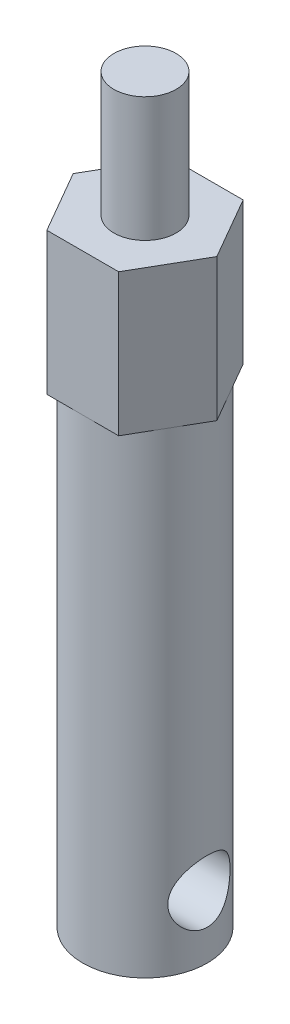
ISO-10303-21;
HEADER;
FILE_DESCRIPTION(('STEP AP214'),'2;1');
FILE_NAME('part.step','',(''),(''),'','','');
FILE_SCHEMA(('AUTOMOTIVE_DESIGN { 1 0 10303 214 1 1 1 1 }'));
ENDSEC;
DATA;
#1=APPLICATION_CONTEXT('core data for automotive mechanical design processes');
#2=APPLICATION_PROTOCOL_DEFINITION('international standard','automotive_design',2000,#1);
#3=PRODUCT_CONTEXT('',#1,'mechanical');
#4=PRODUCT('Part','Part','',(#3));
#5=PRODUCT_RELATED_PRODUCT_CATEGORY('part','',(#4));
#6=PRODUCT_DEFINITION_FORMATION('','',#4);
#7=PRODUCT_DEFINITION_CONTEXT('part definition',#1,'design');
#8=PRODUCT_DEFINITION('design','',#6,#7);
#9=PRODUCT_DEFINITION_SHAPE('','',#8);
#10=(LENGTH_UNIT() NAMED_UNIT(*) SI_UNIT(.MILLI.,.METRE.));
#11=(NAMED_UNIT(*) PLANE_ANGLE_UNIT() SI_UNIT($,.RADIAN.));
#12=(NAMED_UNIT(*) SI_UNIT($,.STERADIAN.) SOLID_ANGLE_UNIT());
#13=UNCERTAINTY_MEASURE_WITH_UNIT(LENGTH_MEASURE(1.E-05),#10,'distance_accuracy_value','');
#14=(GEOMETRIC_REPRESENTATION_CONTEXT(3) GLOBAL_UNCERTAINTY_ASSIGNED_CONTEXT((#13)) GLOBAL_UNIT_ASSIGNED_CONTEXT((#10,
#11,#12)) REPRESENTATION_CONTEXT('',''));
#15=CARTESIAN_POINT('',(0.,0.,0.));
#16=DIRECTION('',(0.,0.,1.));
#17=DIRECTION('',(1.,0.,0.));
#18=AXIS2_PLACEMENT_3D('',#15,#16,#17);
#19=CARTESIAN_POINT('',(0.,48.44415,0.));
#20=DIRECTION('',(0.,-1.,0.));
#21=DIRECTION('',(0.,0.,-1.));
#22=AXIS2_PLACEMENT_3D('',#19,#20,#21);
#23=CYLINDRICAL_SURFACE('',#22,6.35);
#24=CARTESIAN_POINT('',(-5.49926131403118,6.35,-3.175));
#25=CARTESIAN_POINT('',(-5.49926232876913,6.43276191353255,-3.17499905676822));
#26=CARTESIAN_POINT('',(-5.50113815093942,6.51553391504167,-3.1717573852825));
#27=CARTESIAN_POINT('',(-5.50856077670455,6.68042021285867,-3.15884523354688));
#28=CARTESIAN_POINT('',(-5.51410928932437,6.76253418495082,-3.1491717603564));
#29=CARTESIAN_POINT('',(-5.53601678924102,7.0071657484108,-3.11062065473092));
#30=CARTESIAN_POINT('',(-5.55763722742636,7.16782804698103,-3.07221261154103));
#31=CARTESIAN_POINT('',(-5.61178865498313,7.47859781214575,-2.97211747978078));
#32=CARTESIAN_POINT('',(-5.6442615458663,7.62875644018636,-2.9105541372517));
#33=CARTESIAN_POINT('',(-5.71635543890045,7.91661142280003,-2.76627435445934));
#34=CARTESIAN_POINT('',(-5.75597682772092,8.05430710263429,-2.68355676984061));
#35=CARTESIAN_POINT('',(-5.84190034267495,8.32582382133968,-2.49131627779835));
#36=CARTESIAN_POINT('',(-5.88848395338309,8.45838859728169,-2.38014521787043));
#37=CARTESIAN_POINT('',(-5.98081052060146,8.70397079125477,-2.13758083606043));
#38=CARTESIAN_POINT('',(-6.02655304768282,8.816978458905,-2.00617748851801));
#39=CARTESIAN_POINT('',(-6.11573187346572,9.02769095285005,-1.71605436473863));
#40=CARTESIAN_POINT('',(-6.15880487346127,9.12385077893965,-1.55609032527602));
#41=CARTESIAN_POINT('',(-6.23413651147239,9.28732214311138,-1.21969855929243));
#42=CARTESIAN_POINT('',(-6.26640197156108,9.35465188718596,-1.04328130884119));
#43=CARTESIAN_POINT('',(-6.31445464313237,9.45357731453854,-0.692292696730404));
#44=CARTESIAN_POINT('',(-6.33125099630315,9.48737474679419,-0.51848318375818));
#45=CARTESIAN_POINT('',(-6.35024078782237,9.52552742617825,-0.166911747158856));
#46=CARTESIAN_POINT('',(-6.35244306187831,9.52990048775664,0.0108477196166782));
#47=CARTESIAN_POINT('',(-6.34247467450733,9.50992929879483,0.348718268640212));
#48=CARTESIAN_POINT('',(-6.33153724004097,9.48804925678407,0.509019820270688));
#49=CARTESIAN_POINT('',(-6.29838229153245,9.42060336454205,0.823321212955329));
#50=CARTESIAN_POINT('',(-6.27616393341038,9.37503574191341,0.977320581525264));
#51=CARTESIAN_POINT('',(-6.22209775234818,9.2612126859772,1.27733236684466));
#52=CARTESIAN_POINT('',(-6.19012095460315,9.19265207947932,1.42320480220676));
#53=CARTESIAN_POINT('',(-6.11942032404916,9.03521427998409,1.70172616219331));
#54=CARTESIAN_POINT('',(-6.08069407688628,8.94632981335227,1.83437032813194));
#55=CARTESIAN_POINT('',(-5.99580926070808,8.74110469841399,2.09605211974366));
#56=CARTESIAN_POINT('',(-5.94929416927823,8.62296290957092,2.22356359612797));
#57=CARTESIAN_POINT('',(-5.85642633307518,8.36743760647979,2.45777846555886));
#58=CARTESIAN_POINT('',(-5.81007373990265,8.23003942646041,2.56446584928023));
#59=CARTESIAN_POINT('',(-5.71957289604347,7.92905223163107,2.76069102698818));
#60=CARTESIAN_POINT('',(-5.67575155752789,7.76435408894133,2.84870951352546));
#61=CARTESIAN_POINT('',(-5.61885247415839,7.50616243386923,2.95849503046443));
#62=CARTESIAN_POINT('',(-5.60135560040996,7.41822207148829,2.99138760520285));
#63=CARTESIAN_POINT('',(-5.56999217748627,7.23920256178856,3.04938956554735));
#64=CARTESIAN_POINT('',(-5.55612339050229,7.14812538868085,3.07450375064138));
#65=CARTESIAN_POINT('',(-5.53355357587716,6.97084836859624,3.11492823782859));
#66=CARTESIAN_POINT('',(-5.52453156228568,6.88482935786662,3.13085491331031));
#67=CARTESIAN_POINT('',(-5.51045313491466,6.71148937241193,3.15556797554225));
#68=CARTESIAN_POINT('',(-5.50539465890766,6.62416909886637,3.16435807553686));
#69=CARTESIAN_POINT('',(-5.49945626530651,6.44898485113381,3.17466835867007));
#70=CARTESIAN_POINT('',(-5.49857479177741,6.36112109160959,3.17619124884848));
#71=CARTESIAN_POINT('',(-5.50101508803298,6.18565516235741,3.17195985852084));
#72=CARTESIAN_POINT('',(-5.50433657410105,6.09805297537237,3.16620606921981));
#73=CARTESIAN_POINT('',(-5.51925588435845,5.85590741435482,3.14018226453034));
#74=CARTESIAN_POINT('',(-5.53528611699027,5.70239439247137,3.11209439281024));
#75=CARTESIAN_POINT('',(-5.57828096923593,5.40265311940665,3.0343376295836));
#76=CARTESIAN_POINT('',(-5.60524912972109,5.25642724447968,2.98466174914483));
#77=CARTESIAN_POINT('',(-5.66852625788959,4.96757737335142,2.86273054239685));
#78=CARTESIAN_POINT('',(-5.70520999770139,4.82543386796816,2.78953600385261));
#79=CARTESIAN_POINT('',(-5.7834564691364,4.55463281522928,2.62346157669833));
#80=CARTESIAN_POINT('',(-5.82502170218951,4.42598224655787,2.53057157570877));
#81=CARTESIAN_POINT('',(-5.91464405440152,4.16884312848128,2.31405795861388));
#82=CARTESIAN_POINT('',(-5.96285904289681,4.04241923829748,2.18803622695199));
#83=CARTESIAN_POINT('',(-6.0558119327906,3.81186595247963,1.91580928554187));
#84=CARTESIAN_POINT('',(-6.10054865642871,3.70774408767676,1.76959728537411));
#85=CARTESIAN_POINT('',(-6.18303824145362,3.52242847331789,1.45584977269243));
#86=CARTESIAN_POINT('',(-6.22057562531784,3.44191236317373,1.28785333421913));
#87=CARTESIAN_POINT('',(-6.28279651772886,3.31108714177129,0.93828350831361));
#88=CARTESIAN_POINT('',(-6.30749131056505,3.26075150612559,0.756722200806245));
#89=CARTESIAN_POINT('',(-6.33944338582815,3.19605480945969,0.403160492410787));
#90=CARTESIAN_POINT('',(-6.34809271326659,3.17881673569817,0.231811338563335));
#91=CARTESIAN_POINT('',(-6.35133763722966,3.17232264057451,-0.111525009731682));
#92=CARTESIAN_POINT('',(-6.3459381534549,3.18305682371448,-0.283511959769309));
#93=CARTESIAN_POINT('',(-6.32250351776756,3.23029705955796,-0.611308110350746));
#94=CARTESIAN_POINT('',(-6.30532443151586,3.26505827986283,-0.767436553820505));
#95=CARTESIAN_POINT('',(-6.26084894800281,3.35701333933393,-1.07139095342116));
#96=CARTESIAN_POINT('',(-6.23355109988091,3.41421039549079,-1.21921571544173));
#97=CARTESIAN_POINT('',(-6.16984840144776,3.55195793786225,-1.50946910032131));
#98=CARTESIAN_POINT('',(-6.13310397734646,3.6334026281259,-1.65139651176319));
#99=CARTESIAN_POINT('',(-6.05434784579293,3.81621815432935,-1.92016030444462));
#100=CARTESIAN_POINT('',(-6.0123337223239,3.91759814225474,-2.04698971133066));
#101=CARTESIAN_POINT('',(-5.92228494250573,4.14907383129508,-2.29524860659569));
#102=CARTESIAN_POINT('',(-5.87406724075615,4.28102323115206,-2.41488454123001));
#103=CARTESIAN_POINT('',(-5.78049654064408,4.56393373054089,-2.63101905620371));
#104=CARTESIAN_POINT('',(-5.73514610261339,4.71491147125789,-2.7274971667743));
#105=CARTESIAN_POINT('',(-5.67271720109896,4.95567948124437,-2.85396050304134));
#106=CARTESIAN_POINT('',(-5.65257123598791,5.03975772270639,-2.89354057606825));
#107=CARTESIAN_POINT('',(-5.61522862075768,5.21160722451755,-2.96535747654718));
#108=CARTESIAN_POINT('',(-5.59803045260694,5.2993765548833,-2.99759808643801));
#109=CARTESIAN_POINT('',(-5.5673118679383,5.47776900842465,-3.0542719435453));
#110=CARTESIAN_POINT('',(-5.55378200380455,5.56838411683044,-3.07872527562275));
#111=CARTESIAN_POINT('',(-5.53094387019911,5.75188847854092,-3.11956903021308));
#112=CARTESIAN_POINT('',(-5.52163264949546,5.84477609397432,-3.13596509002515));
#113=CARTESIAN_POINT('',(-5.50956192150408,6.00646374879594,-3.15710761797221));
#114=CARTESIAN_POINT('',(-5.5057086840578,6.07493367275989,-3.16381073091702));
#115=CARTESIAN_POINT('',(-5.50055787263126,6.212266718613,-3.17275746355016));
#116=CARTESIAN_POINT('',(-5.49926046961937,6.28112986649722,-3.17500078490813));
#117=CARTESIAN_POINT('',(-5.49926131403118,6.35,-3.175));
#118=B_SPLINE_CURVE_WITH_KNOTS('',3,(#24,#25,#26,#27,#28,#29,#30,#31,#32,#33,#34,#35,#36,#37,
#38,#39,#40,#41,#42,#43,#44,#45,#46,#47,#48,#49,#50,#51,#52,#53,#54,#55,#56,#57,#58,#59,#60,#61,
#62,#63,#64,#65,#66,#67,#68,#69,#70,#71,#72,#73,#74,#75,#76,#77,#78,#79,#80,#81,#82,#83,#84,#85,
#86,#87,#88,#89,#90,#91,#92,#93,#94,#95,#96,#97,#98,#99,#100,#101,#102,#103,#104,#105,#106,#107,
#108,#109,#110,#111,#112,#113,#114,#115,#116,#117),.UNSPECIFIED.,.T.,.F.,(4,2,2,2,2,2,2,2,2,2,2,
2,2,2,2,2,2,2,2,2,2,2,2,2,2,2,2,2,2,2,2,2,2,2,2,2,2,2,2,2,2,2,2,2,2,2,4),(0.,0.248210314193368,
0.496536210172845,0.993616655653378,1.48807751301481,1.98256512428753,2.51783706318107,
3.05337510292796,3.62501229957992,4.19628797710272,4.72691486873112,5.25722047303095,
5.74141031613327,6.22563639342838,6.71656194871309,7.20766347537031,7.74518754975545,
8.28312325280709,8.85521994590916,9.14138502893469,9.42737318655796,9.69083660833535,
9.95416285897606,10.2173910127766,10.4806013985705,10.9489167635524,11.4173838546846,
11.9075481007329,12.3979646273261,12.9502005485241,13.5026226528975,14.0696241997013,
14.6361266987681,15.1506510247058,15.6649951955482,16.1454469295095,16.625967578846,
17.1270402751829,17.6283435455375,18.1795366185793,18.7312151251733,19.0161455987001,
19.3009288973909,19.5849716229022,19.8688153329579,20.075349152287,20.2818967868888),.UNSPECIFIED.);
#119=CARTESIAN_POINT('',(-5.49926131403118,6.35,-3.175));
#120=VERTEX_POINT('',#119);
#121=EDGE_CURVE('E43',#120,#120,#118,.T.);
#122=ORIENTED_EDGE('',*,*,#121,.T.);
#123=EDGE_LOOP('',(#122));
#124=FACE_BOUND('',#123,.T.);
#125=CARTESIAN_POINT('',(5.49926131403118,6.35,-3.175));
#126=CARTESIAN_POINT('',(5.49926232876913,6.26723808646745,-3.17499905676822));
#127=CARTESIAN_POINT('',(5.50113815093942,6.18446608495833,-3.1717573852825));
#128=CARTESIAN_POINT('',(5.50856077670455,6.01957978714132,-3.15884523354688));
#129=CARTESIAN_POINT('',(5.51410928932437,5.93746581504917,-3.1491717603564));
#130=CARTESIAN_POINT('',(5.53601678924102,5.6928342515892,-3.11062065473092));
#131=CARTESIAN_POINT('',(5.55763722742636,5.53217195301897,-3.07221261154103));
#132=CARTESIAN_POINT('',(5.61178865498313,5.22140218785425,-2.97211747978078));
#133=CARTESIAN_POINT('',(5.6442615458663,5.07124355981364,-2.9105541372517));
#134=CARTESIAN_POINT('',(5.71635543890045,4.78338857719997,-2.76627435445934));
#135=CARTESIAN_POINT('',(5.75597682772092,4.64569289736571,-2.68355676984061));
#136=CARTESIAN_POINT('',(5.84190034267495,4.37417617866033,-2.49131627779835));
#137=CARTESIAN_POINT('',(5.88848395338309,4.24161140271831,-2.38014521787043));
#138=CARTESIAN_POINT('',(5.98081052060146,3.99602920874523,-2.13758083606043));
#139=CARTESIAN_POINT('',(6.02655304768282,3.883021541095,-2.00617748851801));
#140=CARTESIAN_POINT('',(6.11573187346572,3.67230904714995,-1.71605436473863));
#141=CARTESIAN_POINT('',(6.15880487346127,3.57614922106035,-1.55609032527602));
#142=CARTESIAN_POINT('',(6.23413651147239,3.41267785688862,-1.21969855929243));
#143=CARTESIAN_POINT('',(6.26640197156108,3.34534811281404,-1.04328130884119));
#144=CARTESIAN_POINT('',(6.31445464313236,3.24642268546146,-0.692292696730402));
#145=CARTESIAN_POINT('',(6.33125099630315,3.21262525320581,-0.518483183758178));
#146=CARTESIAN_POINT('',(6.35024078782237,3.17447257382175,-0.166911747158855));
#147=CARTESIAN_POINT('',(6.35244306187831,3.17009951224336,0.0108477196166791));
#148=CARTESIAN_POINT('',(6.34247467450733,3.19007070120517,0.348718268640213));
#149=CARTESIAN_POINT('',(6.33153724004097,3.21195074321593,0.509019820270689));
#150=CARTESIAN_POINT('',(6.29838229153245,3.27939663545795,0.82332121295533));
#151=CARTESIAN_POINT('',(6.27616393341038,3.32496425808659,0.977320581525265));
#152=CARTESIAN_POINT('',(6.22209775234818,3.4387873140228,1.27733236684466));
#153=CARTESIAN_POINT('',(6.19012095460315,3.50734792052068,1.42320480220676));
#154=CARTESIAN_POINT('',(6.11942032404916,3.66478572001591,1.70172616219331));
#155=CARTESIAN_POINT('',(6.08069407688628,3.75367018664773,1.83437032813194));
#156=CARTESIAN_POINT('',(5.99580926070808,3.95889530158601,2.09605211974367));
#157=CARTESIAN_POINT('',(5.94929416927823,4.07703709042908,2.22356359612797));
#158=CARTESIAN_POINT('',(5.85642633307518,4.33256239352021,2.45777846555886));
#159=CARTESIAN_POINT('',(5.81007373990265,4.46996057353959,2.56446584928023));
#160=CARTESIAN_POINT('',(5.71957289604347,4.77094776836893,2.76069102698818));
#161=CARTESIAN_POINT('',(5.67575155752789,4.93564591105867,2.84870951352547));
#162=CARTESIAN_POINT('',(5.61885247415839,5.19383756613077,2.95849503046443));
#163=CARTESIAN_POINT('',(5.60135560040996,5.28177792851171,2.99138760520285));
#164=CARTESIAN_POINT('',(5.56999217748627,5.46079743821144,3.04938956554735));
#165=CARTESIAN_POINT('',(5.55612339050229,5.55187461131915,3.07450375064138));
#166=CARTESIAN_POINT('',(5.53355357587716,5.72915163140376,3.11492823782859));
#167=CARTESIAN_POINT('',(5.52453156228568,5.81517064213338,3.13085491331031));
#168=CARTESIAN_POINT('',(5.51045313491466,5.98851062758807,3.15556797554225));
#169=CARTESIAN_POINT('',(5.50539465890766,6.07583090113364,3.16435807553686));
#170=CARTESIAN_POINT('',(5.49945626530651,6.2510151488662,3.17466835867007));
#171=CARTESIAN_POINT('',(5.49857479177741,6.33887890839041,3.17619124884848));
#172=CARTESIAN_POINT('',(5.50101508803298,6.51434483764259,3.17195985852084));
#173=CARTESIAN_POINT('',(5.50433657410105,6.60194702462764,3.16620606921981));
#174=CARTESIAN_POINT('',(5.51925588435845,6.84409258564518,3.14018226453034));
#175=CARTESIAN_POINT('',(5.53528611699027,6.99760560752863,3.11209439281024));
#176=CARTESIAN_POINT('',(5.57828096923593,7.29734688059335,3.0343376295836));
#177=CARTESIAN_POINT('',(5.6052491297211,7.44357275552032,2.98466174914483));
#178=CARTESIAN_POINT('',(5.66852625788959,7.73242262664859,2.86273054239685));
#179=CARTESIAN_POINT('',(5.7052099977014,7.87456613203184,2.78953600385261));
#180=CARTESIAN_POINT('',(5.7834564691364,8.14536718477072,2.62346157669833));
#181=CARTESIAN_POINT('',(5.82502170218951,8.27401775344213,2.53057157570877));
#182=CARTESIAN_POINT('',(5.91464405440152,8.53115687151872,2.31405795861388));
#183=CARTESIAN_POINT('',(5.96285904289681,8.65758076170252,2.18803622695199));
#184=CARTESIAN_POINT('',(6.0558119327906,8.88813404752037,1.91580928554187));
#185=CARTESIAN_POINT('',(6.10054865642871,8.99225591232324,1.76959728537411));
#186=CARTESIAN_POINT('',(6.18303824145362,9.17757152668211,1.45584977269243));
#187=CARTESIAN_POINT('',(6.22057562531784,9.25808763682627,1.28785333421913));
#188=CARTESIAN_POINT('',(6.28279651772886,9.38891285822871,0.938283508313608));
#189=CARTESIAN_POINT('',(6.30749131056505,9.43924849387441,0.756722200806243));
#190=CARTESIAN_POINT('',(6.33944338582815,9.50394519054031,0.403160492410785));
#191=CARTESIAN_POINT('',(6.34809271326659,9.52118326430183,0.231811338563332));
#192=CARTESIAN_POINT('',(6.35133763722966,9.52767735942549,-0.111525009731684));
#193=CARTESIAN_POINT('',(6.3459381534549,9.51694317628552,-0.28351195976931));
#194=CARTESIAN_POINT('',(6.32250351776756,9.46970294044204,-0.611308110350746));
#195=CARTESIAN_POINT('',(6.30532443151586,9.43494172013717,-0.767436553820505));
#196=CARTESIAN_POINT('',(6.26084894800281,9.34298666066607,-1.07139095342116));
#197=CARTESIAN_POINT('',(6.23355109988091,9.28578960450921,-1.21921571544173));
#198=CARTESIAN_POINT('',(6.16984840144776,9.14804206213775,-1.50946910032131));
#199=CARTESIAN_POINT('',(6.13310397734646,9.0665973718741,-1.65139651176319));
#200=CARTESIAN_POINT('',(6.05434784579293,8.88378184567065,-1.92016030444462));
#201=CARTESIAN_POINT('',(6.0123337223239,8.78240185774526,-2.04698971133066));
#202=CARTESIAN_POINT('',(5.92228494250573,8.55092616870492,-2.29524860659569));
#203=CARTESIAN_POINT('',(5.87406724075614,8.41897676884794,-2.41488454123001));
#204=CARTESIAN_POINT('',(5.78049654064408,8.1360662694591,-2.63101905620371));
#205=CARTESIAN_POINT('',(5.73514610261339,7.98508852874211,-2.7274971667743));
#206=CARTESIAN_POINT('',(5.67271720109896,7.74432051875563,-2.85396050304135));
#207=CARTESIAN_POINT('',(5.65257123598791,7.66024227729361,-2.89354057606826));
#208=CARTESIAN_POINT('',(5.61522862075768,7.48839277548245,-2.96535747654718));
#209=CARTESIAN_POINT('',(5.59803045260694,7.4006234451167,-2.99759808643801));
#210=CARTESIAN_POINT('',(5.5673118679383,7.22223099157535,-3.0542719435453));
#211=CARTESIAN_POINT('',(5.55378200380455,7.13161588316956,-3.07872527562275));
#212=CARTESIAN_POINT('',(5.53094387019911,6.94811152145907,-3.11956903021308));
#213=CARTESIAN_POINT('',(5.52163264949546,6.85522390602568,-3.13596509002515));
#214=CARTESIAN_POINT('',(5.50956192150408,6.69353625120406,-3.15710761797221));
#215=CARTESIAN_POINT('',(5.5057086840578,6.6250663272401,-3.16381073091702));
#216=CARTESIAN_POINT('',(5.50055787263126,6.487733281387,-3.17275746355016));
#217=CARTESIAN_POINT('',(5.49926046961937,6.41887013350278,-3.17500078490813));
#218=CARTESIAN_POINT('',(5.49926131403118,6.35,-3.175));
#219=B_SPLINE_CURVE_WITH_KNOTS('',3,(#125,#126,#127,#128,#129,#130,#131,#132,#133,#134,#135,
#136,#137,#138,#139,#140,#141,#142,#143,#144,#145,#146,#147,#148,#149,#150,#151,#152,#153,#154,
#155,#156,#157,#158,#159,#160,#161,#162,#163,#164,#165,#166,#167,#168,#169,#170,#171,#172,#173,
#174,#175,#176,#177,#178,#179,#180,#181,#182,#183,#184,#185,#186,#187,#188,#189,#190,#191,#192,
#193,#194,#195,#196,#197,#198,#199,#200,#201,#202,#203,#204,#205,#206,#207,#208,#209,#210,#211,
#212,#213,#214,#215,#216,#217,#218),.UNSPECIFIED.,.T.,.F.,(4,2,2,2,2,2,2,2,2,2,2,2,2,2,2,2,2,2,
2,2,2,2,2,2,2,2,2,2,2,2,2,2,2,2,2,2,2,2,2,2,2,2,2,2,2,2,4),(0.,0.248210314193369,
0.496536210172845,0.993616655653378,1.48807751301481,1.98256512428753,2.51783706318107,
3.05337510292796,3.62501229957992,4.19628797710272,4.72691486873112,5.25722047303095,
5.74141031613327,6.22563639342838,6.71656194871309,7.20766347537031,7.74518754975546,
8.28312325280709,8.85521994590917,9.14138502893469,9.42737318655796,9.69083660833535,
9.95416285897606,10.2173910127766,10.4806013985705,10.9489167635524,11.4173838546846,
11.9075481007329,12.3979646273261,12.9502005485241,13.5026226528976,14.0696241997013,
14.6361266987681,15.1506510247058,15.6649951955482,16.1454469295095,16.625967578846,
17.1270402751829,17.6283435455375,18.1795366185793,18.7312151251733,19.0161455987001,
19.3009288973909,19.5849716229022,19.8688153329579,20.075349152287,20.2818967868888),.UNSPECIFIED.);
#220=CARTESIAN_POINT('',(5.49926131403118,6.35,-3.175));
#221=VERTEX_POINT('',#220);
#222=EDGE_CURVE('E148',#221,#221,#219,.T.);
#223=ORIENTED_EDGE('',*,*,#222,.T.);
#224=EDGE_LOOP('',(#223));
#225=FACE_BOUND('',#224,.T.);
#226=CARTESIAN_POINT('',(0.,48.44415,0.));
#227=DIRECTION('',(0.,1.,0.));
#228=DIRECTION('',(0.,0.,1.));
#229=AXIS2_PLACEMENT_3D('',#226,#227,#228);
#230=CIRCLE('',#229,6.35);
#231=CARTESIAN_POINT('',(0.,48.44415,6.35));
#232=VERTEX_POINT('',#231);
#233=CARTESIAN_POINT('',(5.49926131403119,48.44415,3.175));
#234=VERTEX_POINT('',#233);
#235=EDGE_CURVE('E11',#232,#234,#230,.T.);
#236=ORIENTED_EDGE('',*,*,#235,.F.);
#237=CARTESIAN_POINT('',(-5.49926131403119,48.44415,3.175));
#238=VERTEX_POINT('',#237);
#239=EDGE_CURVE('E54',#238,#232,#230,.T.);
#240=ORIENTED_EDGE('',*,*,#239,.F.);
#241=CARTESIAN_POINT('',(-5.49926131403118,48.44415,-3.175));
#242=VERTEX_POINT('',#241);
#243=EDGE_CURVE('E64',#242,#238,#230,.T.);
#244=ORIENTED_EDGE('',*,*,#243,.F.);
#245=CARTESIAN_POINT('',(0.,48.44415,-6.35));
#246=VERTEX_POINT('',#245);
#247=EDGE_CURVE('E243',#246,#242,#230,.T.);
#248=ORIENTED_EDGE('',*,*,#247,.F.);
#249=CARTESIAN_POINT('',(5.49926131403118,48.44415,-3.175));
#250=VERTEX_POINT('',#249);
#251=EDGE_CURVE('E351',#250,#246,#230,.T.);
#252=ORIENTED_EDGE('',*,*,#251,.F.);
#253=EDGE_CURVE('E52',#234,#250,#230,.T.);
#254=ORIENTED_EDGE('',*,*,#253,.F.);
#255=EDGE_LOOP('',(#236,#240,#244,#248,#252,#254));
#256=FACE_BOUND('',#255,.T.);
#257=CARTESIAN_POINT('',(0.,0.,0.));
#258=DIRECTION('',(0.,1.,0.));
#259=DIRECTION('',(0.,0.,1.));
#260=AXIS2_PLACEMENT_3D('',#257,#258,#259);
#261=CIRCLE('',#260,6.35);
#262=CARTESIAN_POINT('',(0.,0.,6.35));
#263=VERTEX_POINT('',#262);
#264=EDGE_CURVE('E141',#263,#263,#261,.T.);
#265=ORIENTED_EDGE('',*,*,#264,.T.);
#266=EDGE_LOOP('',(#265));
#267=FACE_BOUND('',#266,.T.);
#268=ADVANCED_FACE('F39',(#124,#225,#256,#267),#23,.T.);
#269=CARTESIAN_POINT('',(0.,0.,0.));
#270=DIRECTION('',(0.,1.,0.));
#271=DIRECTION('',(0.,0.,1.));
#272=AXIS2_PLACEMENT_3D('',#269,#270,#271);
#273=PLANE('',#272);
#274=ORIENTED_EDGE('',*,*,#264,.F.);
#275=EDGE_LOOP('',(#274));
#276=FACE_BOUND('',#275,.T.);
#277=ADVANCED_FACE('F171',(#276),#273,.F.);
#278=CARTESIAN_POINT('',(0.,48.44415,0.));
#279=DIRECTION('',(0.,1.,0.));
#280=DIRECTION('',(0.,0.,1.));
#281=AXIS2_PLACEMENT_3D('',#278,#279,#280);
#282=PLANE('',#281);
#283=DIRECTION('',(1.,0.,0.));
#284=VECTOR('',#283,1.);
#285=CARTESIAN_POINT('',(-3.66617420935412,48.44415,6.35));
#286=LINE('',#285,#284);
#287=CARTESIAN_POINT('',(3.66617420935412,48.44415,6.35));
#288=VERTEX_POINT('',#287);
#289=EDGE_CURVE('E215',#232,#288,#286,.T.);
#290=ORIENTED_EDGE('',*,*,#289,.F.);
#291=ORIENTED_EDGE('',*,*,#235,.T.);
#292=DIRECTION('',(0.5,0.,-0.866025403784438));
#293=VECTOR('',#292,1.);
#294=CARTESIAN_POINT('',(3.66617420935412,48.44415,6.35));
#295=LINE('',#294,#293);
#296=EDGE_CURVE('E216',#288,#234,#295,.T.);
#297=ORIENTED_EDGE('',*,*,#296,.F.);
#298=EDGE_LOOP('',(#290,#291,#297));
#299=FACE_BOUND('',#298,.T.);
#300=ADVANCED_FACE('F167',(#299),#282,.F.);
#301=CARTESIAN_POINT('',(7.33234841870825,48.44415,0.));
#302=VERTEX_POINT('',#301);
#303=EDGE_CURVE('E139',#234,#302,#295,.T.);
#304=ORIENTED_EDGE('',*,*,#303,.F.);
#305=ORIENTED_EDGE('',*,*,#253,.T.);
#306=DIRECTION('',(-0.5,0.,-0.866025403784438));
#307=VECTOR('',#306,1.);
#308=CARTESIAN_POINT('',(7.33234841870825,48.44415,0.));
#309=LINE('',#308,#307);
#310=EDGE_CURVE('E249',#302,#250,#309,.T.);
#311=ORIENTED_EDGE('',*,*,#310,.F.);
#312=EDGE_LOOP('',(#304,#305,#311));
#313=FACE_BOUND('',#312,.T.);
#314=ADVANCED_FACE('F170',(#313),#282,.F.);
#315=CARTESIAN_POINT('',(3.66617420935412,48.44415,-6.35));
#316=VERTEX_POINT('',#315);
#317=EDGE_CURVE('E251',#250,#316,#309,.T.);
#318=ORIENTED_EDGE('',*,*,#317,.F.);
#319=ORIENTED_EDGE('',*,*,#251,.T.);
#320=DIRECTION('',(-1.,0.,0.));
#321=VECTOR('',#320,1.);
#322=CARTESIAN_POINT('',(3.66617420935412,48.44415,-6.35));
#323=LINE('',#322,#321);
#324=EDGE_CURVE('E246',#316,#246,#323,.T.);
#325=ORIENTED_EDGE('',*,*,#324,.F.);
#326=EDGE_LOOP('',(#318,#319,#325));
#327=FACE_BOUND('',#326,.T.);
#328=ADVANCED_FACE('F327',(#327),#282,.F.);
#329=CARTESIAN_POINT('',(-3.66617420935412,48.44415,-6.35));
#330=VERTEX_POINT('',#329);
#331=EDGE_CURVE('E241',#246,#330,#323,.T.);
#332=ORIENTED_EDGE('',*,*,#331,.F.);
#333=ORIENTED_EDGE('',*,*,#247,.T.);
#334=DIRECTION('',(-0.5,0.,0.866025403784438));
#335=VECTOR('',#334,1.);
#336=CARTESIAN_POINT('',(-3.66617420935412,48.44415,-6.35));
#337=LINE('',#336,#335);
#338=EDGE_CURVE('E235',#330,#242,#337,.T.);
#339=ORIENTED_EDGE('',*,*,#338,.F.);
#340=EDGE_LOOP('',(#332,#333,#339));
#341=FACE_BOUND('',#340,.T.);
#342=ADVANCED_FACE('F240',(#341),#282,.F.);
#343=CARTESIAN_POINT('',(-7.33234841870825,48.44415,0.));
#344=VERTEX_POINT('',#343);
#345=EDGE_CURVE('E245',#242,#344,#337,.T.);
#346=ORIENTED_EDGE('',*,*,#345,.F.);
#347=ORIENTED_EDGE('',*,*,#243,.T.);
#348=DIRECTION('',(0.5,0.,0.866025403784439));
#349=VECTOR('',#348,1.);
#350=CARTESIAN_POINT('',(-7.33234841870825,48.44415,0.));
#351=LINE('',#350,#349);
#352=EDGE_CURVE('E217',#344,#238,#351,.T.);
#353=ORIENTED_EDGE('',*,*,#352,.F.);
#354=EDGE_LOOP('',(#346,#347,#353));
#355=FACE_BOUND('',#354,.T.);
#356=ADVANCED_FACE('F315',(#355),#282,.F.);
#357=CARTESIAN_POINT('',(-3.66617420935412,48.44415,6.35));
#358=VERTEX_POINT('',#357);
#359=EDGE_CURVE('E213',#238,#358,#351,.T.);
#360=ORIENTED_EDGE('',*,*,#359,.F.);
#361=ORIENTED_EDGE('',*,*,#239,.T.);
#362=EDGE_CURVE('E134',#358,#232,#286,.T.);
#363=ORIENTED_EDGE('',*,*,#362,.F.);
#364=EDGE_LOOP('',(#360,#361,#363));
#365=FACE_BOUND('',#364,.T.);
#366=ADVANCED_FACE('F173',(#365),#282,.F.);
#367=CARTESIAN_POINT('',(3.66617420935412,62.944149936,6.35));
#368=DIRECTION('',(-0.866025403784438,0.,-0.5));
#369=DIRECTION('',(-0.5,0.,0.866025403784438));
#370=AXIS2_PLACEMENT_3D('',#367,#368,#369);
#371=PLANE('',#370);
#372=ORIENTED_EDGE('',*,*,#296,.T.);
#373=ORIENTED_EDGE('',*,*,#303,.T.);
#374=DIRECTION('',(0.,-1.,0.));
#375=VECTOR('',#374,1.);
#376=CARTESIAN_POINT('',(7.33234841870825,62.944149936,0.));
#377=LINE('',#376,#375);
#378=CARTESIAN_POINT('',(7.33234841870825,62.944149936,0.));
#379=VERTEX_POINT('',#378);
#380=EDGE_CURVE('E119',#379,#302,#377,.T.);
#381=ORIENTED_EDGE('',*,*,#380,.F.);
#382=DIRECTION('',(0.5,0.,-0.866025403784438));
#383=VECTOR('',#382,1.);
#384=CARTESIAN_POINT('',(3.66617420935412,62.944149936,6.35));
#385=LINE('',#384,#383);
#386=CARTESIAN_POINT('',(3.66617420935412,62.944149936,6.35));
#387=VERTEX_POINT('',#386);
#388=EDGE_CURVE('E125',#387,#379,#385,.T.);
#389=ORIENTED_EDGE('',*,*,#388,.F.);
#390=DIRECTION('',(0.,-1.,0.));
#391=VECTOR('',#390,1.);
#392=CARTESIAN_POINT('',(3.66617420935412,62.944149936,6.35));
#393=LINE('',#392,#391);
#394=EDGE_CURVE('E225',#387,#288,#393,.T.);
#395=ORIENTED_EDGE('',*,*,#394,.T.);
#396=EDGE_LOOP('',(#372,#373,#381,#389,#395));
#397=FACE_BOUND('',#396,.T.);
#398=ADVANCED_FACE('F137',(#397),#371,.F.);
#399=CARTESIAN_POINT('',(7.33234841870825,62.944149936,0.));
#400=DIRECTION('',(-0.866025403784438,0.,0.5));
#401=DIRECTION('',(0.5,0.,0.866025403784439));
#402=AXIS2_PLACEMENT_3D('',#399,#400,#401);
#403=PLANE('',#402);
#404=ORIENTED_EDGE('',*,*,#310,.T.);
#405=ORIENTED_EDGE('',*,*,#317,.T.);
#406=DIRECTION('',(0.,-1.,0.));
#407=VECTOR('',#406,1.);
#408=CARTESIAN_POINT('',(3.66617420935412,62.944149936,-6.35));
#409=LINE('',#408,#407);
#410=CARTESIAN_POINT('',(3.66617420935412,62.944149936,-6.35));
#411=VERTEX_POINT('',#410);
#412=EDGE_CURVE('E121',#411,#316,#409,.T.);
#413=ORIENTED_EDGE('',*,*,#412,.F.);
#414=DIRECTION('',(-0.5,0.,-0.866025403784438));
#415=VECTOR('',#414,1.);
#416=CARTESIAN_POINT('',(7.33234841870825,62.944149936,0.));
#417=LINE('',#416,#415);
#418=EDGE_CURVE('E114',#379,#411,#417,.T.);
#419=ORIENTED_EDGE('',*,*,#418,.F.);
#420=ORIENTED_EDGE('',*,*,#380,.T.);
#421=EDGE_LOOP('',(#404,#405,#413,#419,#420));
#422=FACE_BOUND('',#421,.T.);
#423=ADVANCED_FACE('F117',(#422),#403,.F.);
#424=CARTESIAN_POINT('',(3.66617420935412,62.944149936,-6.35));
#425=DIRECTION('',(0.,0.,1.));
#426=DIRECTION('',(1.,0.,0.));
#427=AXIS2_PLACEMENT_3D('',#424,#425,#426);
#428=PLANE('',#427);
#429=ORIENTED_EDGE('',*,*,#324,.T.);
#430=ORIENTED_EDGE('',*,*,#331,.T.);
#431=DIRECTION('',(0.,-1.,0.));
#432=VECTOR('',#431,1.);
#433=CARTESIAN_POINT('',(-3.66617420935412,62.944149936,-6.35));
#434=LINE('',#433,#432);
#435=CARTESIAN_POINT('',(-3.66617420935412,62.944149936,-6.35));
#436=VERTEX_POINT('',#435);
#437=EDGE_CURVE('E145',#436,#330,#434,.T.);
#438=ORIENTED_EDGE('',*,*,#437,.F.);
#439=DIRECTION('',(-1.,0.,0.));
#440=VECTOR('',#439,1.);
#441=CARTESIAN_POINT('',(3.66617420935412,62.944149936,-6.35));
#442=LINE('',#441,#440);
#443=EDGE_CURVE('E124',#411,#436,#442,.T.);
#444=ORIENTED_EDGE('',*,*,#443,.F.);
#445=ORIENTED_EDGE('',*,*,#412,.T.);
#446=EDGE_LOOP('',(#429,#430,#438,#444,#445));
#447=FACE_BOUND('',#446,.T.);
#448=ADVANCED_FACE('F184',(#447),#428,.F.);
#449=CARTESIAN_POINT('',(-3.66617420935412,62.944149936,-6.35));
#450=DIRECTION('',(0.866025403784438,0.,0.5));
#451=DIRECTION('',(0.5,0.,-0.866025403784439));
#452=AXIS2_PLACEMENT_3D('',#449,#450,#451);
#453=PLANE('',#452);
#454=ORIENTED_EDGE('',*,*,#338,.T.);
#455=ORIENTED_EDGE('',*,*,#345,.T.);
#456=DIRECTION('',(0.,-1.,0.));
#457=VECTOR('',#456,1.);
#458=CARTESIAN_POINT('',(-7.33234841870825,62.944149936,0.));
#459=LINE('',#458,#457);
#460=CARTESIAN_POINT('',(-7.33234841870825,62.944149936,0.));
#461=VERTEX_POINT('',#460);
#462=EDGE_CURVE('E228',#461,#344,#459,.T.);
#463=ORIENTED_EDGE('',*,*,#462,.F.);
#464=DIRECTION('',(-0.5,0.,0.866025403784438));
#465=VECTOR('',#464,1.);
#466=CARTESIAN_POINT('',(-3.66617420935412,62.944149936,-6.35));
#467=LINE('',#466,#465);
#468=EDGE_CURVE('E237',#436,#461,#467,.T.);
#469=ORIENTED_EDGE('',*,*,#468,.F.);
#470=ORIENTED_EDGE('',*,*,#437,.T.);
#471=EDGE_LOOP('',(#454,#455,#463,#469,#470));
#472=FACE_BOUND('',#471,.T.);
#473=ADVANCED_FACE('F180',(#472),#453,.F.);
#474=CARTESIAN_POINT('',(-7.33234841870825,62.944149936,0.));
#475=DIRECTION('',(0.866025403784439,0.,-0.5));
#476=DIRECTION('',(-0.5,0.,-0.866025403784439));
#477=AXIS2_PLACEMENT_3D('',#474,#475,#476);
#478=PLANE('',#477);
#479=ORIENTED_EDGE('',*,*,#352,.T.);
#480=ORIENTED_EDGE('',*,*,#359,.T.);
#481=DIRECTION('',(0.,-1.,0.));
#482=VECTOR('',#481,1.);
#483=CARTESIAN_POINT('',(-3.66617420935412,62.944149936,6.35));
#484=LINE('',#483,#482);
#485=CARTESIAN_POINT('',(-3.66617420935412,62.944149936,6.35));
#486=VERTEX_POINT('',#485);
#487=EDGE_CURVE('E221',#486,#358,#484,.T.);
#488=ORIENTED_EDGE('',*,*,#487,.F.);
#489=DIRECTION('',(0.5,0.,0.866025403784439));
#490=VECTOR('',#489,1.);
#491=CARTESIAN_POINT('',(-7.33234841870825,62.944149936,0.));
#492=LINE('',#491,#490);
#493=EDGE_CURVE('E254',#461,#486,#492,.T.);
#494=ORIENTED_EDGE('',*,*,#493,.F.);
#495=ORIENTED_EDGE('',*,*,#462,.T.);
#496=EDGE_LOOP('',(#479,#480,#488,#494,#495));
#497=FACE_BOUND('',#496,.T.);
#498=ADVANCED_FACE('F176',(#497),#478,.F.);
#499=CARTESIAN_POINT('',(-3.66617420935412,62.944149936,6.35));
#500=DIRECTION('',(0.,0.,-1.));
#501=DIRECTION('',(-1.,0.,0.));
#502=AXIS2_PLACEMENT_3D('',#499,#500,#501);
#503=PLANE('',#502);
#504=ORIENTED_EDGE('',*,*,#362,.T.);
#505=ORIENTED_EDGE('',*,*,#289,.T.);
#506=ORIENTED_EDGE('',*,*,#394,.F.);
#507=DIRECTION('',(1.,0.,0.));
#508=VECTOR('',#507,1.);
#509=CARTESIAN_POINT('',(-3.66617420935412,62.944149936,6.35));
#510=LINE('',#509,#508);
#511=EDGE_CURVE('E130',#486,#387,#510,.T.);
#512=ORIENTED_EDGE('',*,*,#511,.F.);
#513=ORIENTED_EDGE('',*,*,#487,.T.);
#514=EDGE_LOOP('',(#504,#505,#506,#512,#513));
#515=FACE_BOUND('',#514,.T.);
#516=ADVANCED_FACE('F165',(#515),#503,.F.);
#517=CARTESIAN_POINT('',(0.,62.944149936,0.));
#518=DIRECTION('',(0.,1.,0.));
#519=DIRECTION('',(0.,0.,1.));
#520=AXIS2_PLACEMENT_3D('',#517,#518,#519);
#521=PLANE('',#520);
#522=CARTESIAN_POINT('',(0.,62.944149936,0.));
#523=DIRECTION('',(0.,1.,0.));
#524=DIRECTION('',(0.,0.,1.));
#525=AXIS2_PLACEMENT_3D('',#522,#523,#524);
#526=CIRCLE('',#525,3.175);
#527=CARTESIAN_POINT('',(0.,62.944149936,3.175));
#528=VERTEX_POINT('',#527);
#529=EDGE_CURVE('E258',#528,#528,#526,.T.);
#530=ORIENTED_EDGE('',*,*,#529,.F.);
#531=EDGE_LOOP('',(#530));
#532=FACE_BOUND('',#531,.T.);
#533=ORIENTED_EDGE('',*,*,#388,.T.);
#534=ORIENTED_EDGE('',*,*,#418,.T.);
#535=ORIENTED_EDGE('',*,*,#443,.T.);
#536=ORIENTED_EDGE('',*,*,#468,.T.);
#537=ORIENTED_EDGE('',*,*,#493,.T.);
#538=ORIENTED_EDGE('',*,*,#511,.T.);
#539=EDGE_LOOP('',(#533,#534,#535,#536,#537,#538));
#540=FACE_BOUND('',#539,.T.);
#541=ADVANCED_FACE('F128',(#532,#540),#521,.T.);
#542=CARTESIAN_POINT('',(-7.33234841870825,6.35,0.));
#543=DIRECTION('',(1.,0.,0.));
#544=DIRECTION('',(0.,0.,-1.));
#545=AXIS2_PLACEMENT_3D('',#542,#543,#544);
#546=CYLINDRICAL_SURFACE('',#545,3.175);
#547=ORIENTED_EDGE('',*,*,#222,.F.);
#548=EDGE_LOOP('',(#547));
#549=FACE_BOUND('',#548,.T.);
#550=ORIENTED_EDGE('',*,*,#121,.F.);
#551=EDGE_LOOP('',(#550));
#552=FACE_BOUND('',#551,.T.);
#553=ADVANCED_FACE('F154',(#549,#552),#546,.F.);
#554=CARTESIAN_POINT('',(0.,75.644149936,0.));
#555=DIRECTION('',(0.,-1.,0.));
#556=DIRECTION('',(0.,0.,-1.));
#557=AXIS2_PLACEMENT_3D('',#554,#555,#556);
#558=CYLINDRICAL_SURFACE('',#557,3.175);
#559=CARTESIAN_POINT('',(0.,75.644149936,0.));
#560=DIRECTION('',(0.,1.,0.));
#561=DIRECTION('',(0.,0.,1.));
#562=AXIS2_PLACEMENT_3D('',#559,#560,#561);
#563=CIRCLE('',#562,3.175);
#564=CARTESIAN_POINT('',(0.,75.644149936,3.175));
#565=VERTEX_POINT('',#564);
#566=EDGE_CURVE('E153',#565,#565,#563,.T.);
#567=ORIENTED_EDGE('',*,*,#566,.F.);
#568=EDGE_LOOP('',(#567));
#569=FACE_BOUND('',#568,.T.);
#570=ORIENTED_EDGE('',*,*,#529,.T.);
#571=EDGE_LOOP('',(#570));
#572=FACE_BOUND('',#571,.T.);
#573=ADVANCED_FACE('F159',(#569,#572),#558,.T.);
#574=CARTESIAN_POINT('',(0.,75.644149936,0.));
#575=DIRECTION('',(0.,1.,0.));
#576=DIRECTION('',(0.,0.,1.));
#577=AXIS2_PLACEMENT_3D('',#574,#575,#576);
#578=PLANE('',#577);
#579=ORIENTED_EDGE('',*,*,#566,.T.);
#580=EDGE_LOOP('',(#579));
#581=FACE_BOUND('',#580,.T.);
#582=ADVANCED_FACE('F264',(#581),#578,.T.);
#583=CLOSED_SHELL('',(#268,#277,#300,#314,#328,#342,#356,#366,#398,#423,#448,#473,#498,#516,
#541,#553,#573,#582));
#584=MANIFOLD_SOLID_BREP('B2',#583);
#585=ADVANCED_BREP_SHAPE_REPRESENTATION('',(#18,#584),#14);
#586=SHAPE_DEFINITION_REPRESENTATION(#9,#585);
ENDSEC;
END-ISO-10303-21;
